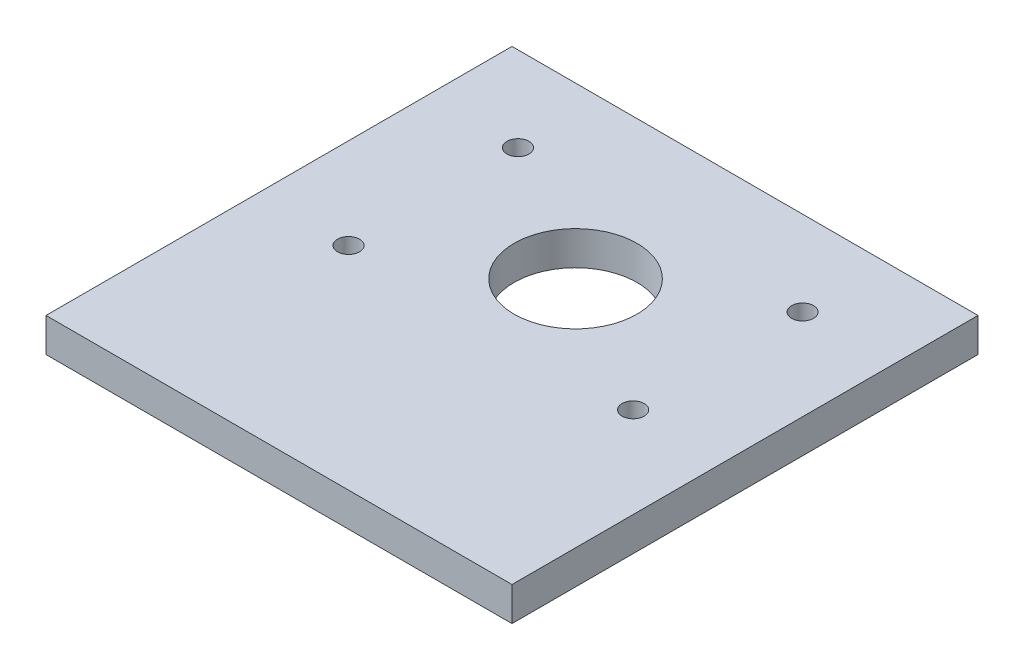
ISO-10303-21;
HEADER;
FILE_DESCRIPTION(('STEP AP214'),'2;1');
FILE_NAME('part.step','',(''),(''),'','','');
FILE_SCHEMA(('AUTOMOTIVE_DESIGN { 1 0 10303 214 1 1 1 1 }'));
ENDSEC;
DATA;
#1=APPLICATION_CONTEXT('core data for automotive mechanical design processes');
#2=APPLICATION_PROTOCOL_DEFINITION('international standard','automotive_design',2000,#1);
#3=PRODUCT_CONTEXT('',#1,'mechanical');
#4=PRODUCT('Part','Part','',(#3));
#5=PRODUCT_RELATED_PRODUCT_CATEGORY('part','',(#4));
#6=PRODUCT_DEFINITION_FORMATION('','',#4);
#7=PRODUCT_DEFINITION_CONTEXT('part definition',#1,'design');
#8=PRODUCT_DEFINITION('design','',#6,#7);
#9=PRODUCT_DEFINITION_SHAPE('','',#8);
#10=(LENGTH_UNIT() NAMED_UNIT(*) SI_UNIT(.MILLI.,.METRE.));
#11=(NAMED_UNIT(*) PLANE_ANGLE_UNIT() SI_UNIT($,.RADIAN.));
#12=(NAMED_UNIT(*) SI_UNIT($,.STERADIAN.) SOLID_ANGLE_UNIT());
#13=UNCERTAINTY_MEASURE_WITH_UNIT(LENGTH_MEASURE(1.E-05),#10,'distance_accuracy_value','');
#14=(GEOMETRIC_REPRESENTATION_CONTEXT(3) GLOBAL_UNCERTAINTY_ASSIGNED_CONTEXT((#13)) GLOBAL_UNIT_ASSIGNED_CONTEXT((#10,
#11,#12)) REPRESENTATION_CONTEXT('',''));
#15=CARTESIAN_POINT('',(0.,0.,0.));
#16=DIRECTION('',(0.,0.,1.));
#17=DIRECTION('',(1.,0.,0.));
#18=AXIS2_PLACEMENT_3D('',#15,#16,#17);
#19=CARTESIAN_POINT('',(0.,8.,0.));
#20=DIRECTION('',(0.,-1.,0.));
#21=DIRECTION('',(0.,0.,-1.));
#22=AXIS2_PLACEMENT_3D('',#19,#20,#21);
#23=PLANE('',#22);
#24=DIRECTION('',(0.,0.,-1.));
#25=VECTOR('',#24,1.);
#26=CARTESIAN_POINT('',(55.,8.,55.));
#27=LINE('',#26,#25);
#28=CARTESIAN_POINT('',(55.,8.,55.));
#29=VERTEX_POINT('',#28);
#30=CARTESIAN_POINT('',(55.,8.,-55.));
#31=VERTEX_POINT('',#30);
#32=EDGE_CURVE('E93',#29,#31,#27,.T.);
#33=ORIENTED_EDGE('',*,*,#32,.T.);
#34=DIRECTION('',(-1.,0.,0.));
#35=VECTOR('',#34,1.);
#36=CARTESIAN_POINT('',(-55.,8.,-55.));
#37=LINE('',#36,#35);
#38=CARTESIAN_POINT('',(-55.,8.,-55.));
#39=VERTEX_POINT('',#38);
#40=EDGE_CURVE('E88',#31,#39,#37,.T.);
#41=ORIENTED_EDGE('',*,*,#40,.T.);
#42=DIRECTION('',(0.,0.,1.));
#43=VECTOR('',#42,1.);
#44=CARTESIAN_POINT('',(-55.,8.,55.));
#45=LINE('',#44,#43);
#46=CARTESIAN_POINT('',(-55.,8.,55.));
#47=VERTEX_POINT('',#46);
#48=EDGE_CURVE('E90',#39,#47,#45,.T.);
#49=ORIENTED_EDGE('',*,*,#48,.T.);
#50=DIRECTION('',(1.,0.,0.));
#51=VECTOR('',#50,1.);
#52=CARTESIAN_POINT('',(-55.,8.,55.));
#53=LINE('',#52,#51);
#54=EDGE_CURVE('E57',#47,#29,#53,.T.);
#55=ORIENTED_EDGE('',*,*,#54,.T.);
#56=EDGE_LOOP('',(#33,#41,#49,#55));
#57=FACE_BOUND('',#56,.T.);
#58=CARTESIAN_POINT('',(0.,8.,-15.));
#59=DIRECTION('',(0.,1.,0.));
#60=DIRECTION('',(0.,0.,1.));
#61=AXIS2_PLACEMENT_3D('',#58,#59,#60);
#62=CIRCLE('',#61,14.5);
#63=CARTESIAN_POINT('',(0.,8.,-0.499999999999999));
#64=VERTEX_POINT('',#63);
#65=EDGE_CURVE('E106',#64,#64,#62,.T.);
#66=ORIENTED_EDGE('',*,*,#65,.F.);
#67=EDGE_LOOP('',(#66));
#68=FACE_BOUND('',#67,.T.);
#69=CARTESIAN_POINT('',(-33.5915,8.,-35.));
#70=DIRECTION('',(0.,1.,0.));
#71=DIRECTION('',(0.,0.,1.));
#72=AXIS2_PLACEMENT_3D('',#69,#70,#71);
#73=CIRCLE('',#72,2.6);
#74=CARTESIAN_POINT('',(-33.5915,8.,-32.4));
#75=VERTEX_POINT('',#74);
#76=EDGE_CURVE('E124',#75,#75,#73,.T.);
#77=ORIENTED_EDGE('',*,*,#76,.F.);
#78=EDGE_LOOP('',(#77));
#79=FACE_BOUND('',#78,.T.);
#80=CARTESIAN_POINT('',(33.5915,8.,-35.));
#81=DIRECTION('',(0.,1.,0.));
#82=DIRECTION('',(0.,0.,1.));
#83=AXIS2_PLACEMENT_3D('',#80,#81,#82);
#84=CIRCLE('',#83,2.6);
#85=CARTESIAN_POINT('',(33.5915,8.,-32.4));
#86=VERTEX_POINT('',#85);
#87=EDGE_CURVE('E130',#86,#86,#84,.T.);
#88=ORIENTED_EDGE('',*,*,#87,.F.);
#89=EDGE_LOOP('',(#88));
#90=FACE_BOUND('',#89,.T.);
#91=CARTESIAN_POINT('',(33.5915,8.,5.));
#92=DIRECTION('',(0.,1.,0.));
#93=DIRECTION('',(0.,0.,1.));
#94=AXIS2_PLACEMENT_3D('',#91,#92,#93);
#95=CIRCLE('',#94,2.6);
#96=CARTESIAN_POINT('',(33.5915,8.,7.59999999999999));
#97=VERTEX_POINT('',#96);
#98=EDGE_CURVE('E134',#97,#97,#95,.T.);
#99=ORIENTED_EDGE('',*,*,#98,.F.);
#100=EDGE_LOOP('',(#99));
#101=FACE_BOUND('',#100,.T.);
#102=CARTESIAN_POINT('',(-33.5915,8.,5.00000000000001));
#103=DIRECTION('',(0.,1.,0.));
#104=DIRECTION('',(0.,0.,1.));
#105=AXIS2_PLACEMENT_3D('',#102,#103,#104);
#106=CIRCLE('',#105,2.6);
#107=CARTESIAN_POINT('',(-33.5915,8.,7.60000000000001));
#108=VERTEX_POINT('',#107);
#109=EDGE_CURVE('E138',#108,#108,#106,.T.);
#110=ORIENTED_EDGE('',*,*,#109,.F.);
#111=EDGE_LOOP('',(#110));
#112=FACE_BOUND('',#111,.T.);
#113=ADVANCED_FACE('F39',(#57,#68,#79,#90,#101,#112),#23,.F.);
#114=CARTESIAN_POINT('',(0.,0.,0.));
#115=DIRECTION('',(0.,-1.,0.));
#116=DIRECTION('',(0.,0.,-1.));
#117=AXIS2_PLACEMENT_3D('',#114,#115,#116);
#118=PLANE('',#117);
#119=CARTESIAN_POINT('',(33.5915,0.,5.));
#120=DIRECTION('',(0.,1.,0.));
#121=DIRECTION('',(0.,0.,1.));
#122=AXIS2_PLACEMENT_3D('',#119,#120,#121);
#123=CIRCLE('',#122,2.6);
#124=CARTESIAN_POINT('',(33.5915,0.,7.59999999999999));
#125=VERTEX_POINT('',#124);
#126=EDGE_CURVE('E139',#125,#125,#123,.T.);
#127=ORIENTED_EDGE('',*,*,#126,.T.);
#128=EDGE_LOOP('',(#127));
#129=FACE_BOUND('',#128,.T.);
#130=CARTESIAN_POINT('',(-33.5915,0.,-35.));
#131=DIRECTION('',(0.,1.,0.));
#132=DIRECTION('',(0.,0.,1.));
#133=AXIS2_PLACEMENT_3D('',#130,#131,#132);
#134=CIRCLE('',#133,2.6);
#135=CARTESIAN_POINT('',(-33.5915,0.,-32.4));
#136=VERTEX_POINT('',#135);
#137=EDGE_CURVE('E123',#136,#136,#134,.T.);
#138=ORIENTED_EDGE('',*,*,#137,.T.);
#139=EDGE_LOOP('',(#138));
#140=FACE_BOUND('',#139,.T.);
#141=DIRECTION('',(0.,0.,-1.));
#142=VECTOR('',#141,1.);
#143=CARTESIAN_POINT('',(55.,0.,55.));
#144=LINE('',#143,#142);
#145=CARTESIAN_POINT('',(55.,0.,55.));
#146=VERTEX_POINT('',#145);
#147=CARTESIAN_POINT('',(55.,0.,-55.));
#148=VERTEX_POINT('',#147);
#149=EDGE_CURVE('E103',#146,#148,#144,.T.);
#150=ORIENTED_EDGE('',*,*,#149,.F.);
#151=DIRECTION('',(1.,0.,0.));
#152=VECTOR('',#151,1.);
#153=CARTESIAN_POINT('',(-55.,0.,55.));
#154=LINE('',#153,#152);
#155=CARTESIAN_POINT('',(-55.,0.,55.));
#156=VERTEX_POINT('',#155);
#157=EDGE_CURVE('E76',#156,#146,#154,.T.);
#158=ORIENTED_EDGE('',*,*,#157,.F.);
#159=DIRECTION('',(0.,0.,1.));
#160=VECTOR('',#159,1.);
#161=CARTESIAN_POINT('',(-55.,0.,55.));
#162=LINE('',#161,#160);
#163=CARTESIAN_POINT('',(-55.,0.,-55.));
#164=VERTEX_POINT('',#163);
#165=EDGE_CURVE('E71',#164,#156,#162,.T.);
#166=ORIENTED_EDGE('',*,*,#165,.F.);
#167=DIRECTION('',(-1.,0.,0.));
#168=VECTOR('',#167,1.);
#169=CARTESIAN_POINT('',(-55.,0.,-55.));
#170=LINE('',#169,#168);
#171=EDGE_CURVE('E92',#148,#164,#170,.T.);
#172=ORIENTED_EDGE('',*,*,#171,.F.);
#173=EDGE_LOOP('',(#150,#158,#166,#172));
#174=FACE_BOUND('',#173,.T.);
#175=CARTESIAN_POINT('',(0.,0.,-15.));
#176=DIRECTION('',(0.,1.,0.));
#177=DIRECTION('',(0.,0.,1.));
#178=AXIS2_PLACEMENT_3D('',#175,#176,#177);
#179=CIRCLE('',#178,14.5);
#180=CARTESIAN_POINT('',(0.,0.,-0.499999999999999));
#181=VERTEX_POINT('',#180);
#182=EDGE_CURVE('E119',#181,#181,#179,.T.);
#183=ORIENTED_EDGE('',*,*,#182,.T.);
#184=EDGE_LOOP('',(#183));
#185=FACE_BOUND('',#184,.T.);
#186=CARTESIAN_POINT('',(33.5915,0.,-35.));
#187=DIRECTION('',(0.,1.,0.));
#188=DIRECTION('',(0.,0.,1.));
#189=AXIS2_PLACEMENT_3D('',#186,#187,#188);
#190=CIRCLE('',#189,2.6);
#191=CARTESIAN_POINT('',(33.5915,0.,-32.4));
#192=VERTEX_POINT('',#191);
#193=EDGE_CURVE('E128',#192,#192,#190,.T.);
#194=ORIENTED_EDGE('',*,*,#193,.T.);
#195=EDGE_LOOP('',(#194));
#196=FACE_BOUND('',#195,.T.);
#197=CARTESIAN_POINT('',(-33.5915,0.,5.00000000000001));
#198=DIRECTION('',(0.,1.,0.));
#199=DIRECTION('',(0.,0.,1.));
#200=AXIS2_PLACEMENT_3D('',#197,#198,#199);
#201=CIRCLE('',#200,2.6);
#202=CARTESIAN_POINT('',(-33.5915,0.,7.60000000000001));
#203=VERTEX_POINT('',#202);
#204=EDGE_CURVE('E142',#203,#203,#201,.T.);
#205=ORIENTED_EDGE('',*,*,#204,.T.);
#206=EDGE_LOOP('',(#205));
#207=FACE_BOUND('',#206,.T.);
#208=ADVANCED_FACE('F111',(#129,#140,#174,#185,#196,#207),#118,.T.);
#209=CARTESIAN_POINT('',(55.,8.,55.));
#210=DIRECTION('',(-1.,0.,0.));
#211=DIRECTION('',(0.,0.,1.));
#212=AXIS2_PLACEMENT_3D('',#209,#210,#211);
#213=PLANE('',#212);
#214=ORIENTED_EDGE('',*,*,#149,.T.);
#215=DIRECTION('',(0.,-1.,0.));
#216=VECTOR('',#215,1.);
#217=CARTESIAN_POINT('',(55.,8.,-55.));
#218=LINE('',#217,#216);
#219=EDGE_CURVE('E11',#31,#148,#218,.T.);
#220=ORIENTED_EDGE('',*,*,#219,.F.);
#221=ORIENTED_EDGE('',*,*,#32,.F.);
#222=DIRECTION('',(0.,-1.,0.));
#223=VECTOR('',#222,1.);
#224=CARTESIAN_POINT('',(55.,8.,55.));
#225=LINE('',#224,#223);
#226=EDGE_CURVE('E97',#29,#146,#225,.T.);
#227=ORIENTED_EDGE('',*,*,#226,.T.);
#228=EDGE_LOOP('',(#214,#220,#221,#227));
#229=FACE_BOUND('',#228,.T.);
#230=ADVANCED_FACE('F41',(#229),#213,.F.);
#231=CARTESIAN_POINT('',(-55.,8.,-55.));
#232=DIRECTION('',(0.,0.,1.));
#233=DIRECTION('',(1.,0.,0.));
#234=AXIS2_PLACEMENT_3D('',#231,#232,#233);
#235=PLANE('',#234);
#236=ORIENTED_EDGE('',*,*,#171,.T.);
#237=DIRECTION('',(0.,-1.,0.));
#238=VECTOR('',#237,1.);
#239=CARTESIAN_POINT('',(-55.,8.,-55.));
#240=LINE('',#239,#238);
#241=EDGE_CURVE('E48',#39,#164,#240,.T.);
#242=ORIENTED_EDGE('',*,*,#241,.F.);
#243=ORIENTED_EDGE('',*,*,#40,.F.);
#244=ORIENTED_EDGE('',*,*,#219,.T.);
#245=EDGE_LOOP('',(#236,#242,#243,#244));
#246=FACE_BOUND('',#245,.T.);
#247=ADVANCED_FACE('F94',(#246),#235,.F.);
#248=CARTESIAN_POINT('',(-55.,8.,55.));
#249=DIRECTION('',(1.,0.,0.));
#250=DIRECTION('',(0.,0.,-1.));
#251=AXIS2_PLACEMENT_3D('',#248,#249,#250);
#252=PLANE('',#251);
#253=ORIENTED_EDGE('',*,*,#165,.T.);
#254=DIRECTION('',(0.,-1.,0.));
#255=VECTOR('',#254,1.);
#256=CARTESIAN_POINT('',(-55.,8.,55.));
#257=LINE('',#256,#255);
#258=EDGE_CURVE('E96',#47,#156,#257,.T.);
#259=ORIENTED_EDGE('',*,*,#258,.F.);
#260=ORIENTED_EDGE('',*,*,#48,.F.);
#261=ORIENTED_EDGE('',*,*,#241,.T.);
#262=EDGE_LOOP('',(#253,#259,#260,#261));
#263=FACE_BOUND('',#262,.T.);
#264=ADVANCED_FACE('F100',(#263),#252,.F.);
#265=CARTESIAN_POINT('',(-55.,8.,55.));
#266=DIRECTION('',(0.,0.,-1.));
#267=DIRECTION('',(-1.,0.,0.));
#268=AXIS2_PLACEMENT_3D('',#265,#266,#267);
#269=PLANE('',#268);
#270=ORIENTED_EDGE('',*,*,#157,.T.);
#271=ORIENTED_EDGE('',*,*,#226,.F.);
#272=ORIENTED_EDGE('',*,*,#54,.F.);
#273=ORIENTED_EDGE('',*,*,#258,.T.);
#274=EDGE_LOOP('',(#270,#271,#272,#273));
#275=FACE_BOUND('',#274,.T.);
#276=ADVANCED_FACE('F112',(#275),#269,.F.);
#277=CARTESIAN_POINT('',(0.,8.,-15.));
#278=DIRECTION('',(0.,-1.,0.));
#279=DIRECTION('',(0.,0.,-1.));
#280=AXIS2_PLACEMENT_3D('',#277,#278,#279);
#281=CYLINDRICAL_SURFACE('',#280,14.5);
#282=ORIENTED_EDGE('',*,*,#65,.T.);
#283=EDGE_LOOP('',(#282));
#284=FACE_BOUND('',#283,.T.);
#285=ORIENTED_EDGE('',*,*,#182,.F.);
#286=EDGE_LOOP('',(#285));
#287=FACE_BOUND('',#286,.T.);
#288=ADVANCED_FACE('F157',(#284,#287),#281,.F.);
#289=CARTESIAN_POINT('',(-33.5915,8.,-35.));
#290=DIRECTION('',(0.,-1.,0.));
#291=DIRECTION('',(0.,0.,-1.));
#292=AXIS2_PLACEMENT_3D('',#289,#290,#291);
#293=CYLINDRICAL_SURFACE('',#292,2.6);
#294=ORIENTED_EDGE('',*,*,#76,.T.);
#295=EDGE_LOOP('',(#294));
#296=FACE_BOUND('',#295,.T.);
#297=ORIENTED_EDGE('',*,*,#137,.F.);
#298=EDGE_LOOP('',(#297));
#299=FACE_BOUND('',#298,.T.);
#300=ADVANCED_FACE('F204',(#296,#299),#293,.F.);
#301=CARTESIAN_POINT('',(33.5915,8.,-35.));
#302=DIRECTION('',(0.,-1.,0.));
#303=DIRECTION('',(0.,0.,-1.));
#304=AXIS2_PLACEMENT_3D('',#301,#302,#303);
#305=CYLINDRICAL_SURFACE('',#304,2.6);
#306=ORIENTED_EDGE('',*,*,#87,.T.);
#307=EDGE_LOOP('',(#306));
#308=FACE_BOUND('',#307,.T.);
#309=ORIENTED_EDGE('',*,*,#193,.F.);
#310=EDGE_LOOP('',(#309));
#311=FACE_BOUND('',#310,.T.);
#312=ADVANCED_FACE('F215',(#308,#311),#305,.F.);
#313=CARTESIAN_POINT('',(33.5915,8.,5.));
#314=DIRECTION('',(0.,-1.,0.));
#315=DIRECTION('',(0.,0.,-1.));
#316=AXIS2_PLACEMENT_3D('',#313,#314,#315);
#317=CYLINDRICAL_SURFACE('',#316,2.6);
#318=ORIENTED_EDGE('',*,*,#98,.T.);
#319=EDGE_LOOP('',(#318));
#320=FACE_BOUND('',#319,.T.);
#321=ORIENTED_EDGE('',*,*,#126,.F.);
#322=EDGE_LOOP('',(#321));
#323=FACE_BOUND('',#322,.T.);
#324=ADVANCED_FACE('F219',(#320,#323),#317,.F.);
#325=CARTESIAN_POINT('',(-33.5915,8.,5.00000000000001));
#326=DIRECTION('',(0.,-1.,0.));
#327=DIRECTION('',(0.,0.,-1.));
#328=AXIS2_PLACEMENT_3D('',#325,#326,#327);
#329=CYLINDRICAL_SURFACE('',#328,2.6);
#330=ORIENTED_EDGE('',*,*,#109,.T.);
#331=EDGE_LOOP('',(#330));
#332=FACE_BOUND('',#331,.T.);
#333=ORIENTED_EDGE('',*,*,#204,.F.);
#334=EDGE_LOOP('',(#333));
#335=FACE_BOUND('',#334,.T.);
#336=ADVANCED_FACE('F146',(#332,#335),#329,.F.);
#337=CLOSED_SHELL('',(#113,#208,#230,#247,#264,#276,#288,#300,#312,#324,#336));
#338=MANIFOLD_SOLID_BREP('B2',#337);
#339=ADVANCED_BREP_SHAPE_REPRESENTATION('',(#18,#338),#14);
#340=SHAPE_DEFINITION_REPRESENTATION(#9,#339);
ENDSEC;
END-ISO-10303-21;
